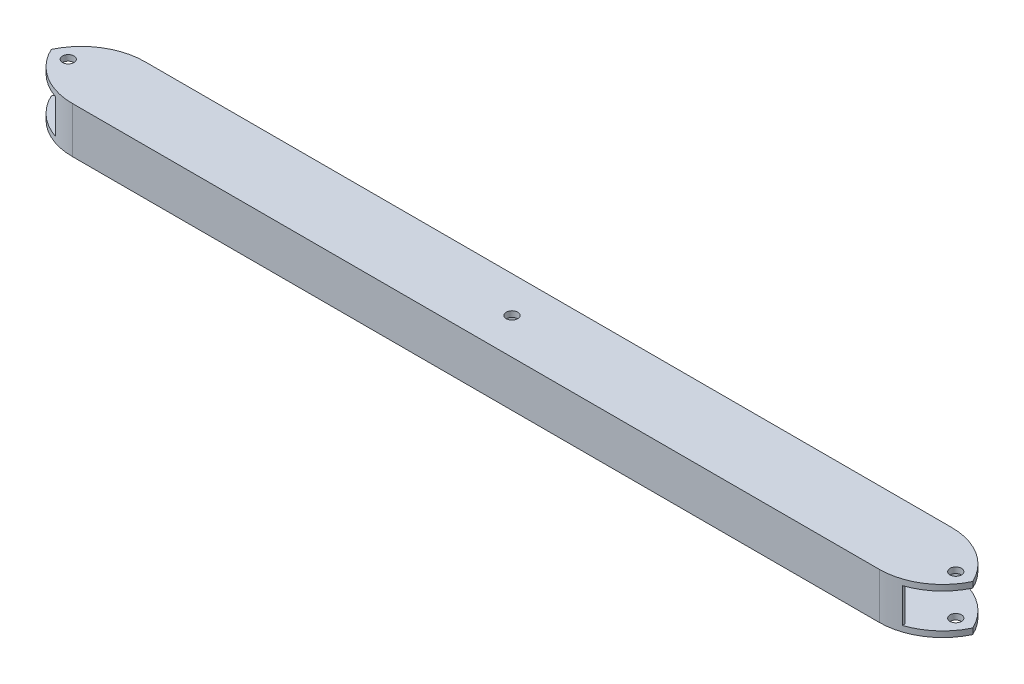
ISO-10303-21;
HEADER;
FILE_DESCRIPTION(('STEP AP214'),'2;1');
FILE_NAME('part.step','',(''),(''),'','','');
FILE_SCHEMA(('AUTOMOTIVE_DESIGN { 1 0 10303 214 1 1 1 1 }'));
ENDSEC;
DATA;
#1=APPLICATION_CONTEXT('core data for automotive mechanical design processes');
#2=APPLICATION_PROTOCOL_DEFINITION('international standard','automotive_design',2000,#1);
#3=PRODUCT_CONTEXT('',#1,'mechanical');
#4=PRODUCT('Part','Part','',(#3));
#5=PRODUCT_RELATED_PRODUCT_CATEGORY('part','',(#4));
#6=PRODUCT_DEFINITION_FORMATION('','',#4);
#7=PRODUCT_DEFINITION_CONTEXT('part definition',#1,'design');
#8=PRODUCT_DEFINITION('design','',#6,#7);
#9=PRODUCT_DEFINITION_SHAPE('','',#8);
#10=(LENGTH_UNIT() NAMED_UNIT(*) SI_UNIT(.MILLI.,.METRE.));
#11=(NAMED_UNIT(*) PLANE_ANGLE_UNIT() SI_UNIT($,.RADIAN.));
#12=(NAMED_UNIT(*) SI_UNIT($,.STERADIAN.) SOLID_ANGLE_UNIT());
#13=UNCERTAINTY_MEASURE_WITH_UNIT(LENGTH_MEASURE(1.E-05),#10,'distance_accuracy_value','');
#14=(GEOMETRIC_REPRESENTATION_CONTEXT(3) GLOBAL_UNCERTAINTY_ASSIGNED_CONTEXT((#13)) GLOBAL_UNIT_ASSIGNED_CONTEXT((#10,
#11,#12)) REPRESENTATION_CONTEXT('',''));
#15=CARTESIAN_POINT('',(0.,0.,0.));
#16=DIRECTION('',(0.,0.,1.));
#17=DIRECTION('',(1.,0.,0.));
#18=AXIS2_PLACEMENT_3D('',#15,#16,#17);
#19=CARTESIAN_POINT('',(515.5,25.4,40.0000000000002));
#20=DIRECTION('',(0.,0.,-1.));
#21=DIRECTION('',(-1.,0.,0.));
#22=AXIS2_PLACEMENT_3D('',#19,#20,#21);
#23=PLANE('',#22);
#24=DIRECTION('',(1.,0.,0.));
#25=VECTOR('',#24,1.);
#26=CARTESIAN_POINT('',(515.5,0.,40.0000000000002));
#27=LINE('',#26,#25);
#28=CARTESIAN_POINT('',(35.,0.,40.0000000000001));
#29=VERTEX_POINT('',#28);
#30=CARTESIAN_POINT('',(480.5,0.,40.0000000000002));
#31=VERTEX_POINT('',#30);
#32=EDGE_CURVE('E222',#29,#31,#27,.T.);
#33=ORIENTED_EDGE('',*,*,#32,.T.);
#34=DIRECTION('',(0.,-1.,0.));
#35=VECTOR('',#34,1.);
#36=CARTESIAN_POINT('',(480.5,25.4,40.0000000000002));
#37=LINE('',#36,#35);
#38=CARTESIAN_POINT('',(480.5,25.4,40.0000000000002));
#39=VERTEX_POINT('',#38);
#40=EDGE_CURVE('E283',#31,#39,#37,.F.);
#41=ORIENTED_EDGE('',*,*,#40,.T.);
#42=DIRECTION('',(1.,0.,0.));
#43=VECTOR('',#42,1.);
#44=CARTESIAN_POINT('',(515.5,25.4,40.0000000000002));
#45=LINE('',#44,#43);
#46=CARTESIAN_POINT('',(35.,25.4,40.0000000000001));
#47=VERTEX_POINT('',#46);
#48=EDGE_CURVE('E225',#47,#39,#45,.T.);
#49=ORIENTED_EDGE('',*,*,#48,.F.);
#50=DIRECTION('',(0.,-1.,0.));
#51=VECTOR('',#50,1.);
#52=CARTESIAN_POINT('',(35.,25.4,40.0000000000001));
#53=LINE('',#52,#51);
#54=EDGE_CURVE('E281',#47,#29,#53,.T.);
#55=ORIENTED_EDGE('',*,*,#54,.T.);
#56=EDGE_LOOP('',(#33,#41,#49,#55));
#57=FACE_BOUND('',#56,.T.);
#58=ADVANCED_FACE('F36',(#57),#23,.F.);
#59=CARTESIAN_POINT('',(0.,25.4,0.));
#60=DIRECTION('',(0.,0.,1.));
#61=DIRECTION('',(1.,0.,0.));
#62=AXIS2_PLACEMENT_3D('',#59,#60,#61);
#63=PLANE('',#62);
#64=DIRECTION('',(0.,-1.,0.));
#65=VECTOR('',#64,1.);
#66=CARTESIAN_POINT('',(480.5,25.4,0.));
#67=LINE('',#66,#65);
#68=CARTESIAN_POINT('',(480.5,25.4,0.));
#69=VERTEX_POINT('',#68);
#70=CARTESIAN_POINT('',(480.5,0.,0.));
#71=VERTEX_POINT('',#70);
#72=EDGE_CURVE('E244',#69,#71,#67,.T.);
#73=ORIENTED_EDGE('',*,*,#72,.T.);
#74=DIRECTION('',(-1.,0.,0.));
#75=VECTOR('',#74,1.);
#76=CARTESIAN_POINT('',(0.,0.,0.));
#77=LINE('',#76,#75);
#78=CARTESIAN_POINT('',(35.,0.,0.));
#79=VERTEX_POINT('',#78);
#80=EDGE_CURVE('E228',#71,#79,#77,.T.);
#81=ORIENTED_EDGE('',*,*,#80,.T.);
#82=DIRECTION('',(0.,-1.,0.));
#83=VECTOR('',#82,1.);
#84=CARTESIAN_POINT('',(35.,25.4,0.));
#85=LINE('',#84,#83);
#86=CARTESIAN_POINT('',(35.,25.4,0.));
#87=VERTEX_POINT('',#86);
#88=EDGE_CURVE('E242',#79,#87,#85,.F.);
#89=ORIENTED_EDGE('',*,*,#88,.T.);
#90=DIRECTION('',(-1.,0.,0.));
#91=VECTOR('',#90,1.);
#92=CARTESIAN_POINT('',(0.,25.4,0.));
#93=LINE('',#92,#91);
#94=EDGE_CURVE('E227',#69,#87,#93,.T.);
#95=ORIENTED_EDGE('',*,*,#94,.F.);
#96=EDGE_LOOP('',(#73,#81,#89,#95));
#97=FACE_BOUND('',#96,.T.);
#98=ADVANCED_FACE('F334',(#97),#63,.F.);
#99=CARTESIAN_POINT('',(257.75,25.4,20.));
#100=DIRECTION('',(0.,-1.,0.));
#101=DIRECTION('',(0.,0.,-1.));
#102=AXIS2_PLACEMENT_3D('',#99,#100,#101);
#103=CYLINDRICAL_SURFACE('',#102,3.17499999999997);
#104=CARTESIAN_POINT('',(257.75,22.225,20.));
#105=DIRECTION('',(0.,1.,0.));
#106=DIRECTION('',(0.,0.,1.));
#107=AXIS2_PLACEMENT_3D('',#104,#105,#106);
#108=CIRCLE('',#107,3.17499999999997);
#109=CARTESIAN_POINT('',(257.75,22.225,23.175));
#110=VERTEX_POINT('',#109);
#111=EDGE_CURVE('E203',#110,#110,#108,.T.);
#112=ORIENTED_EDGE('',*,*,#111,.F.);
#113=EDGE_LOOP('',(#112));
#114=FACE_BOUND('',#113,.T.);
#115=CARTESIAN_POINT('',(257.75,25.4,20.));
#116=DIRECTION('',(0.,1.,0.));
#117=DIRECTION('',(0.,0.,1.));
#118=AXIS2_PLACEMENT_3D('',#115,#116,#117);
#119=CIRCLE('',#118,3.17499999999997);
#120=CARTESIAN_POINT('',(257.75,25.4,23.175));
#121=VERTEX_POINT('',#120);
#122=EDGE_CURVE('E219',#121,#121,#119,.T.);
#123=ORIENTED_EDGE('',*,*,#122,.T.);
#124=EDGE_LOOP('',(#123));
#125=FACE_BOUND('',#124,.T.);
#126=ADVANCED_FACE('F369',(#114,#125),#103,.F.);
#127=CARTESIAN_POINT('',(502.72,25.4,20.));
#128=DIRECTION('',(0.,-1.,0.));
#129=DIRECTION('',(0.,0.,-1.));
#130=AXIS2_PLACEMENT_3D('',#127,#128,#129);
#131=CYLINDRICAL_SURFACE('',#130,3.17500000000008);
#132=CARTESIAN_POINT('',(502.72,22.225,20.));
#133=DIRECTION('',(0.,1.,0.));
#134=DIRECTION('',(0.,0.,1.));
#135=AXIS2_PLACEMENT_3D('',#132,#133,#134);
#136=CIRCLE('',#135,3.17500000000008);
#137=CARTESIAN_POINT('',(502.72,22.225,23.1750000000001));
#138=VERTEX_POINT('',#137);
#139=EDGE_CURVE('E200',#138,#138,#136,.T.);
#140=ORIENTED_EDGE('',*,*,#139,.F.);
#141=EDGE_LOOP('',(#140));
#142=FACE_BOUND('',#141,.T.);
#143=CARTESIAN_POINT('',(502.72,25.4,20.));
#144=DIRECTION('',(0.,1.,0.));
#145=DIRECTION('',(0.,0.,-1.));
#146=AXIS2_PLACEMENT_3D('',#143,#144,#145);
#147=CIRCLE('',#146,3.17500000000008);
#148=CARTESIAN_POINT('',(502.72,25.4,16.8249999999999));
#149=VERTEX_POINT('',#148);
#150=EDGE_CURVE('E213',#149,#149,#147,.T.);
#151=ORIENTED_EDGE('',*,*,#150,.T.);
#152=EDGE_LOOP('',(#151));
#153=FACE_BOUND('',#152,.T.);
#154=ADVANCED_FACE('F362',(#142,#153),#131,.F.);
#155=CARTESIAN_POINT('',(12.78,25.4,20.0000000000001));
#156=DIRECTION('',(0.,-1.,0.));
#157=DIRECTION('',(0.,0.,-1.));
#158=AXIS2_PLACEMENT_3D('',#155,#156,#157);
#159=CYLINDRICAL_SURFACE('',#158,3.175);
#160=CARTESIAN_POINT('',(12.78,22.225,20.0000000000001));
#161=DIRECTION('',(0.,1.,0.));
#162=DIRECTION('',(0.,0.,1.));
#163=AXIS2_PLACEMENT_3D('',#160,#161,#162);
#164=CIRCLE('',#163,3.175);
#165=CARTESIAN_POINT('',(12.78,22.225,23.1750000000001));
#166=VERTEX_POINT('',#165);
#167=EDGE_CURVE('E199',#166,#166,#164,.T.);
#168=ORIENTED_EDGE('',*,*,#167,.F.);
#169=EDGE_LOOP('',(#168));
#170=FACE_BOUND('',#169,.T.);
#171=CARTESIAN_POINT('',(12.78,25.4,20.0000000000001));
#172=DIRECTION('',(0.,1.,0.));
#173=DIRECTION('',(0.,0.,1.));
#174=AXIS2_PLACEMENT_3D('',#171,#172,#173);
#175=CIRCLE('',#174,3.175);
#176=CARTESIAN_POINT('',(12.78,25.4,23.1750000000001));
#177=VERTEX_POINT('',#176);
#178=EDGE_CURVE('E207',#177,#177,#175,.T.);
#179=ORIENTED_EDGE('',*,*,#178,.T.);
#180=EDGE_LOOP('',(#179));
#181=FACE_BOUND('',#180,.T.);
#182=ADVANCED_FACE('F353',(#170,#181),#159,.F.);
#183=CARTESIAN_POINT('',(0.,25.4,0.));
#184=DIRECTION('',(0.,-1.,0.));
#185=DIRECTION('',(0.,0.,-1.));
#186=AXIS2_PLACEMENT_3D('',#183,#184,#185);
#187=PLANE('',#186);
#188=CARTESIAN_POINT('',(480.5,25.4,5.00000000000021));
#189=DIRECTION('',(0.,-1.,0.));
#190=DIRECTION('',(0.,0.,-1.));
#191=AXIS2_PLACEMENT_3D('',#188,#189,#190);
#192=CIRCLE('',#191,35.);
#193=CARTESIAN_POINT('',(512.122776601684,25.4,20.0000000000001));
#194=VERTEX_POINT('',#193);
#195=EDGE_CURVE('E53',#39,#194,#192,.F.);
#196=ORIENTED_EDGE('',*,*,#195,.T.);
#197=CARTESIAN_POINT('',(480.5,25.4,35.));
#198=DIRECTION('',(0.,-1.,0.));
#199=DIRECTION('',(0.,0.,-1.));
#200=AXIS2_PLACEMENT_3D('',#197,#198,#199);
#201=CIRCLE('',#200,35.);
#202=EDGE_CURVE('E279',#194,#69,#201,.F.);
#203=ORIENTED_EDGE('',*,*,#202,.T.);
#204=ORIENTED_EDGE('',*,*,#94,.T.);
#205=CARTESIAN_POINT('',(35.,25.4,35.));
#206=DIRECTION('',(0.,-1.,0.));
#207=DIRECTION('',(0.,0.,-1.));
#208=AXIS2_PLACEMENT_3D('',#205,#206,#207);
#209=CIRCLE('',#208,35.);
#210=CARTESIAN_POINT('',(3.37722339831621,25.4,20.));
#211=VERTEX_POINT('',#210);
#212=EDGE_CURVE('E60',#87,#211,#209,.F.);
#213=ORIENTED_EDGE('',*,*,#212,.T.);
#214=CARTESIAN_POINT('',(35.,25.4,5.00000000000008));
#215=DIRECTION('',(0.,-1.,0.));
#216=DIRECTION('',(0.,0.,-1.));
#217=AXIS2_PLACEMENT_3D('',#214,#215,#216);
#218=CIRCLE('',#217,35.);
#219=EDGE_CURVE('E276',#211,#47,#218,.F.);
#220=ORIENTED_EDGE('',*,*,#219,.T.);
#221=ORIENTED_EDGE('',*,*,#48,.T.);
#222=EDGE_LOOP('',(#196,#203,#204,#213,#220,#221));
#223=FACE_BOUND('',#222,.T.);
#224=ORIENTED_EDGE('',*,*,#122,.F.);
#225=EDGE_LOOP('',(#224));
#226=FACE_BOUND('',#225,.T.);
#227=ORIENTED_EDGE('',*,*,#150,.F.);
#228=EDGE_LOOP('',(#227));
#229=FACE_BOUND('',#228,.T.);
#230=ORIENTED_EDGE('',*,*,#178,.F.);
#231=EDGE_LOOP('',(#230));
#232=FACE_BOUND('',#231,.T.);
#233=ADVANCED_FACE('F350',(#223,#226,#229,#232),#187,.F.);
#234=CARTESIAN_POINT('',(0.,0.,0.));
#235=DIRECTION('',(0.,-1.,0.));
#236=DIRECTION('',(0.,0.,-1.));
#237=AXIS2_PLACEMENT_3D('',#234,#235,#236);
#238=PLANE('',#237);
#239=CARTESIAN_POINT('',(502.72,0.,20.));
#240=DIRECTION('',(0.,1.,0.));
#241=DIRECTION('',(0.,0.,-1.));
#242=AXIS2_PLACEMENT_3D('',#239,#240,#241);
#243=CIRCLE('',#242,3.17500000000008);
#244=CARTESIAN_POINT('',(502.72,0.,16.8249999999999));
#245=VERTEX_POINT('',#244);
#246=EDGE_CURVE('E210',#245,#245,#243,.T.);
#247=ORIENTED_EDGE('',*,*,#246,.T.);
#248=EDGE_LOOP('',(#247));
#249=FACE_BOUND('',#248,.T.);
#250=ORIENTED_EDGE('',*,*,#80,.F.);
#251=CARTESIAN_POINT('',(480.5,0.,35.));
#252=DIRECTION('',(0.,-1.,0.));
#253=DIRECTION('',(0.,0.,-1.));
#254=AXIS2_PLACEMENT_3D('',#251,#252,#253);
#255=CIRCLE('',#254,35.);
#256=CARTESIAN_POINT('',(512.122776601684,0.,20.0000000000001));
#257=VERTEX_POINT('',#256);
#258=EDGE_CURVE('E254',#71,#257,#255,.T.);
#259=ORIENTED_EDGE('',*,*,#258,.T.);
#260=CARTESIAN_POINT('',(480.5,0.,5.00000000000021));
#261=DIRECTION('',(0.,-1.,0.));
#262=DIRECTION('',(0.,0.,-1.));
#263=AXIS2_PLACEMENT_3D('',#260,#261,#262);
#264=CIRCLE('',#263,35.);
#265=EDGE_CURVE('E251',#257,#31,#264,.T.);
#266=ORIENTED_EDGE('',*,*,#265,.T.);
#267=ORIENTED_EDGE('',*,*,#32,.F.);
#268=CARTESIAN_POINT('',(35.,0.,5.00000000000008));
#269=DIRECTION('',(0.,-1.,0.));
#270=DIRECTION('',(0.,0.,-1.));
#271=AXIS2_PLACEMENT_3D('',#268,#269,#270);
#272=CIRCLE('',#271,35.);
#273=CARTESIAN_POINT('',(3.37722339831621,0.,20.));
#274=VERTEX_POINT('',#273);
#275=EDGE_CURVE('E249',#29,#274,#272,.T.);
#276=ORIENTED_EDGE('',*,*,#275,.T.);
#277=CARTESIAN_POINT('',(35.,0.,35.));
#278=DIRECTION('',(0.,-1.,0.));
#279=DIRECTION('',(0.,0.,-1.));
#280=AXIS2_PLACEMENT_3D('',#277,#278,#279);
#281=CIRCLE('',#280,35.);
#282=EDGE_CURVE('E246',#274,#79,#281,.T.);
#283=ORIENTED_EDGE('',*,*,#282,.T.);
#284=EDGE_LOOP('',(#250,#259,#266,#267,#276,#283));
#285=FACE_BOUND('',#284,.T.);
#286=CARTESIAN_POINT('',(257.75,0.,20.));
#287=DIRECTION('',(0.,1.,0.));
#288=DIRECTION('',(0.,0.,1.));
#289=AXIS2_PLACEMENT_3D('',#286,#287,#288);
#290=CIRCLE('',#289,3.17499999999997);
#291=CARTESIAN_POINT('',(257.75,0.,23.175));
#292=VERTEX_POINT('',#291);
#293=EDGE_CURVE('E216',#292,#292,#290,.T.);
#294=ORIENTED_EDGE('',*,*,#293,.T.);
#295=EDGE_LOOP('',(#294));
#296=FACE_BOUND('',#295,.T.);
#297=CARTESIAN_POINT('',(12.78,0.,20.0000000000001));
#298=DIRECTION('',(0.,1.,0.));
#299=DIRECTION('',(0.,0.,1.));
#300=AXIS2_PLACEMENT_3D('',#297,#298,#299);
#301=CIRCLE('',#300,3.175);
#302=CARTESIAN_POINT('',(12.78,0.,23.1750000000001));
#303=VERTEX_POINT('',#302);
#304=EDGE_CURVE('E206',#303,#303,#301,.T.);
#305=ORIENTED_EDGE('',*,*,#304,.T.);
#306=EDGE_LOOP('',(#305));
#307=FACE_BOUND('',#306,.T.);
#308=ADVANCED_FACE('F330',(#249,#285,#296,#307),#238,.T.);
#309=CARTESIAN_POINT('',(257.75,3.175,20.));
#310=DIRECTION('',(0.,-1.,0.));
#311=DIRECTION('',(0.,0.,-1.));
#312=AXIS2_PLACEMENT_3D('',#309,#310,#311);
#313=CIRCLE('',#312,3.17499999999997);
#314=CARTESIAN_POINT('',(257.75,3.175,16.825));
#315=VERTEX_POINT('',#314);
#316=EDGE_CURVE('E196',#315,#315,#313,.T.);
#317=ORIENTED_EDGE('',*,*,#316,.F.);
#318=EDGE_LOOP('',(#317));
#319=FACE_BOUND('',#318,.T.);
#320=ORIENTED_EDGE('',*,*,#293,.F.);
#321=EDGE_LOOP('',(#320));
#322=FACE_BOUND('',#321,.T.);
#323=ADVANCED_FACE('F464',(#319,#322),#103,.F.);
#324=CARTESIAN_POINT('',(502.72,3.175,20.));
#325=DIRECTION('',(0.,-1.,0.));
#326=DIRECTION('',(0.,0.,-1.));
#327=AXIS2_PLACEMENT_3D('',#324,#325,#326);
#328=CIRCLE('',#327,3.17500000000008);
#329=CARTESIAN_POINT('',(502.72,3.175,16.8249999999999));
#330=VERTEX_POINT('',#329);
#331=EDGE_CURVE('E183',#330,#330,#328,.T.);
#332=ORIENTED_EDGE('',*,*,#331,.F.);
#333=EDGE_LOOP('',(#332));
#334=FACE_BOUND('',#333,.T.);
#335=ORIENTED_EDGE('',*,*,#246,.F.);
#336=EDGE_LOOP('',(#335));
#337=FACE_BOUND('',#336,.T.);
#338=ADVANCED_FACE('F372',(#334,#337),#131,.F.);
#339=CARTESIAN_POINT('',(12.78,3.175,20.0000000000001));
#340=DIRECTION('',(0.,-1.,0.));
#341=DIRECTION('',(0.,0.,-1.));
#342=AXIS2_PLACEMENT_3D('',#339,#340,#341);
#343=CIRCLE('',#342,3.175);
#344=CARTESIAN_POINT('',(12.78,3.175,16.8250000000001));
#345=VERTEX_POINT('',#344);
#346=EDGE_CURVE('E179',#345,#345,#343,.T.);
#347=ORIENTED_EDGE('',*,*,#346,.F.);
#348=EDGE_LOOP('',(#347));
#349=FACE_BOUND('',#348,.T.);
#350=ORIENTED_EDGE('',*,*,#304,.F.);
#351=EDGE_LOOP('',(#350));
#352=FACE_BOUND('',#351,.T.);
#353=ADVANCED_FACE('F365',(#349,#352),#159,.F.);
#354=CARTESIAN_POINT('',(554.168139339772,22.225,36.8250000000001));
#355=DIRECTION('',(0.,1.,0.));
#356=DIRECTION('',(0.,0.,1.));
#357=AXIS2_PLACEMENT_3D('',#354,#355,#356);
#358=PLANE('',#357);
#359=ORIENTED_EDGE('',*,*,#111,.T.);
#360=EDGE_LOOP('',(#359));
#361=FACE_BOUND('',#360,.T.);
#362=DIRECTION('',(0.,0.,-1.));
#363=VECTOR('',#362,1.);
#364=CARTESIAN_POINT('',(491.5,22.225,0.));
#365=LINE('',#364,#363);
#366=CARTESIAN_POINT('',(491.5,22.225,3.175));
#367=VERTEX_POINT('',#366);
#368=CARTESIAN_POINT('',(491.5,22.225,1.77350454832765));
#369=VERTEX_POINT('',#368);
#370=EDGE_CURVE('E165',#367,#369,#365,.T.);
#371=ORIENTED_EDGE('',*,*,#370,.T.);
#372=CARTESIAN_POINT('',(480.5,22.225,35.));
#373=DIRECTION('',(0.,1.,0.));
#374=DIRECTION('',(0.,0.,1.));
#375=AXIS2_PLACEMENT_3D('',#372,#373,#374);
#376=CIRCLE('',#375,35.);
#377=CARTESIAN_POINT('',(512.122776601684,22.225,20.0000000000001));
#378=VERTEX_POINT('',#377);
#379=EDGE_CURVE('E273',#369,#378,#376,.F.);
#380=ORIENTED_EDGE('',*,*,#379,.T.);
#381=CARTESIAN_POINT('',(480.5,22.225,5.00000000000021));
#382=DIRECTION('',(0.,1.,0.));
#383=DIRECTION('',(0.,0.,1.));
#384=AXIS2_PLACEMENT_3D('',#381,#382,#383);
#385=CIRCLE('',#384,35.);
#386=CARTESIAN_POINT('',(491.5,22.225,38.2264954516725));
#387=VERTEX_POINT('',#386);
#388=EDGE_CURVE('E161',#378,#387,#385,.F.);
#389=ORIENTED_EDGE('',*,*,#388,.T.);
#390=CARTESIAN_POINT('',(491.5,22.225,36.8250000000001));
#391=VERTEX_POINT('',#390);
#392=EDGE_CURVE('E151',#387,#391,#365,.T.);
#393=ORIENTED_EDGE('',*,*,#392,.T.);
#394=DIRECTION('',(-1.,0.,0.));
#395=VECTOR('',#394,1.);
#396=CARTESIAN_POINT('',(554.168139339772,22.225,36.8250000000001));
#397=LINE('',#396,#395);
#398=CARTESIAN_POINT('',(24.,22.225,36.8250000000001));
#399=VERTEX_POINT('',#398);
#400=EDGE_CURVE('E158',#391,#399,#397,.T.);
#401=ORIENTED_EDGE('',*,*,#400,.T.);
#402=DIRECTION('',(0.,0.,-1.));
#403=VECTOR('',#402,1.);
#404=CARTESIAN_POINT('',(24.,22.225,0.));
#405=LINE('',#404,#403);
#406=CARTESIAN_POINT('',(24.,22.225,38.2264954516724));
#407=VERTEX_POINT('',#406);
#408=EDGE_CURVE('E315',#407,#399,#405,.T.);
#409=ORIENTED_EDGE('',*,*,#408,.F.);
#410=CARTESIAN_POINT('',(35.,22.225,5.00000000000008));
#411=DIRECTION('',(0.,1.,0.));
#412=DIRECTION('',(0.,0.,1.));
#413=AXIS2_PLACEMENT_3D('',#410,#411,#412);
#414=CIRCLE('',#413,35.);
#415=CARTESIAN_POINT('',(3.37722339831621,22.225,20.));
#416=VERTEX_POINT('',#415);
#417=EDGE_CURVE('E270',#407,#416,#414,.F.);
#418=ORIENTED_EDGE('',*,*,#417,.T.);
#419=CARTESIAN_POINT('',(35.,22.225,35.));
#420=DIRECTION('',(0.,1.,0.));
#421=DIRECTION('',(0.,0.,1.));
#422=AXIS2_PLACEMENT_3D('',#419,#420,#421);
#423=CIRCLE('',#422,35.);
#424=CARTESIAN_POINT('',(24.,22.225,1.7735045483277));
#425=VERTEX_POINT('',#424);
#426=EDGE_CURVE('E268',#416,#425,#423,.F.);
#427=ORIENTED_EDGE('',*,*,#426,.T.);
#428=CARTESIAN_POINT('',(24.,22.225,3.175));
#429=VERTEX_POINT('',#428);
#430=EDGE_CURVE('E173',#429,#425,#405,.T.);
#431=ORIENTED_EDGE('',*,*,#430,.F.);
#432=DIRECTION('',(-1.,0.,0.));
#433=VECTOR('',#432,1.);
#434=CARTESIAN_POINT('',(554.168139339772,22.225,3.175));
#435=LINE('',#434,#433);
#436=EDGE_CURVE('E192',#367,#429,#435,.T.);
#437=ORIENTED_EDGE('',*,*,#436,.F.);
#438=EDGE_LOOP('',(#371,#380,#389,#393,#401,#409,#418,#427,#431,#437));
#439=FACE_BOUND('',#438,.T.);
#440=ORIENTED_EDGE('',*,*,#167,.T.);
#441=EDGE_LOOP('',(#440));
#442=FACE_BOUND('',#441,.T.);
#443=ORIENTED_EDGE('',*,*,#139,.T.);
#444=EDGE_LOOP('',(#443));
#445=FACE_BOUND('',#444,.T.);
#446=ADVANCED_FACE('F154',(#361,#439,#442,#445),#358,.F.);
#447=CARTESIAN_POINT('',(554.168139339772,3.175,36.8250000000001));
#448=DIRECTION('',(0.,0.,1.));
#449=DIRECTION('',(1.,0.,0.));
#450=AXIS2_PLACEMENT_3D('',#447,#448,#449);
#451=PLANE('',#450);
#452=ORIENTED_EDGE('',*,*,#400,.F.);
#453=DIRECTION('',(0.,-1.,0.));
#454=VECTOR('',#453,1.);
#455=CARTESIAN_POINT('',(491.5,3.175,36.8250000000001));
#456=LINE('',#455,#454);
#457=CARTESIAN_POINT('',(491.5,3.175,36.8250000000001));
#458=VERTEX_POINT('',#457);
#459=EDGE_CURVE('E168',#391,#458,#456,.T.);
#460=ORIENTED_EDGE('',*,*,#459,.T.);
#461=DIRECTION('',(-1.,0.,0.));
#462=VECTOR('',#461,1.);
#463=CARTESIAN_POINT('',(554.168139339772,3.175,36.8250000000001));
#464=LINE('',#463,#462);
#465=CARTESIAN_POINT('',(24.,3.175,36.8250000000001));
#466=VERTEX_POINT('',#465);
#467=EDGE_CURVE('E180',#458,#466,#464,.T.);
#468=ORIENTED_EDGE('',*,*,#467,.T.);
#469=DIRECTION('',(0.,1.,0.));
#470=VECTOR('',#469,1.);
#471=CARTESIAN_POINT('',(24.,3.175,36.8250000000001));
#472=LINE('',#471,#470);
#473=EDGE_CURVE('E178',#466,#399,#472,.T.);
#474=ORIENTED_EDGE('',*,*,#473,.T.);
#475=EDGE_LOOP('',(#452,#460,#468,#474));
#476=FACE_BOUND('',#475,.T.);
#477=ADVANCED_FACE('F176',(#476),#451,.F.);
#478=CARTESIAN_POINT('',(554.168139339772,3.175,3.175));
#479=DIRECTION('',(0.,-1.,0.));
#480=DIRECTION('',(0.,0.,-1.));
#481=AXIS2_PLACEMENT_3D('',#478,#479,#480);
#482=PLANE('',#481);
#483=ORIENTED_EDGE('',*,*,#316,.T.);
#484=EDGE_LOOP('',(#483));
#485=FACE_BOUND('',#484,.T.);
#486=CARTESIAN_POINT('',(480.5,3.175,5.00000000000021));
#487=DIRECTION('',(0.,-1.,0.));
#488=DIRECTION('',(0.,0.,-1.));
#489=AXIS2_PLACEMENT_3D('',#486,#487,#488);
#490=CIRCLE('',#489,35.);
#491=CARTESIAN_POINT('',(491.5,3.175,38.2264954516725));
#492=VERTEX_POINT('',#491);
#493=CARTESIAN_POINT('',(512.122776601684,3.175,20.0000000000001));
#494=VERTEX_POINT('',#493);
#495=EDGE_CURVE('E261',#492,#494,#490,.F.);
#496=ORIENTED_EDGE('',*,*,#495,.T.);
#497=CARTESIAN_POINT('',(480.5,3.175,35.));
#498=DIRECTION('',(0.,-1.,0.));
#499=DIRECTION('',(0.,0.,-1.));
#500=AXIS2_PLACEMENT_3D('',#497,#498,#499);
#501=CIRCLE('',#500,35.);
#502=CARTESIAN_POINT('',(491.5,3.175,1.77350454832765));
#503=VERTEX_POINT('',#502);
#504=EDGE_CURVE('E263',#494,#503,#501,.F.);
#505=ORIENTED_EDGE('',*,*,#504,.T.);
#506=DIRECTION('',(0.,0.,1.));
#507=VECTOR('',#506,1.);
#508=CARTESIAN_POINT('',(491.5,3.175,40.0000000000001));
#509=LINE('',#508,#507);
#510=CARTESIAN_POINT('',(491.5,3.175,3.175));
#511=VERTEX_POINT('',#510);
#512=EDGE_CURVE('E174',#503,#511,#509,.T.);
#513=ORIENTED_EDGE('',*,*,#512,.T.);
#514=DIRECTION('',(-1.,0.,0.));
#515=VECTOR('',#514,1.);
#516=CARTESIAN_POINT('',(554.168139339772,3.175,3.175));
#517=LINE('',#516,#515);
#518=CARTESIAN_POINT('',(24.,3.175,3.175));
#519=VERTEX_POINT('',#518);
#520=EDGE_CURVE('E185',#511,#519,#517,.T.);
#521=ORIENTED_EDGE('',*,*,#520,.T.);
#522=DIRECTION('',(0.,0.,1.));
#523=VECTOR('',#522,1.);
#524=CARTESIAN_POINT('',(24.,3.175,40.0000000000001));
#525=LINE('',#524,#523);
#526=CARTESIAN_POINT('',(24.,3.175,1.7735045483277));
#527=VERTEX_POINT('',#526);
#528=EDGE_CURVE('E319',#527,#519,#525,.T.);
#529=ORIENTED_EDGE('',*,*,#528,.F.);
#530=CARTESIAN_POINT('',(35.,3.175,35.));
#531=DIRECTION('',(0.,-1.,0.));
#532=DIRECTION('',(0.,0.,-1.));
#533=AXIS2_PLACEMENT_3D('',#530,#531,#532);
#534=CIRCLE('',#533,35.);
#535=CARTESIAN_POINT('',(3.37722339831621,3.175,20.));
#536=VERTEX_POINT('',#535);
#537=EDGE_CURVE('E256',#527,#536,#534,.F.);
#538=ORIENTED_EDGE('',*,*,#537,.T.);
#539=CARTESIAN_POINT('',(35.,3.175,5.00000000000008));
#540=DIRECTION('',(0.,-1.,0.));
#541=DIRECTION('',(0.,0.,-1.));
#542=AXIS2_PLACEMENT_3D('',#539,#540,#541);
#543=CIRCLE('',#542,35.);
#544=CARTESIAN_POINT('',(24.,3.175,38.2264954516724));
#545=VERTEX_POINT('',#544);
#546=EDGE_CURVE('E258',#536,#545,#543,.F.);
#547=ORIENTED_EDGE('',*,*,#546,.T.);
#548=EDGE_CURVE('E317',#466,#545,#525,.T.);
#549=ORIENTED_EDGE('',*,*,#548,.F.);
#550=ORIENTED_EDGE('',*,*,#467,.F.);
#551=EDGE_CURVE('E164',#458,#492,#509,.T.);
#552=ORIENTED_EDGE('',*,*,#551,.T.);
#553=EDGE_LOOP('',(#496,#505,#513,#521,#529,#538,#547,#549,#550,#552));
#554=FACE_BOUND('',#553,.T.);
#555=ORIENTED_EDGE('',*,*,#346,.T.);
#556=EDGE_LOOP('',(#555));
#557=FACE_BOUND('',#556,.T.);
#558=ORIENTED_EDGE('',*,*,#331,.T.);
#559=EDGE_LOOP('',(#558));
#560=FACE_BOUND('',#559,.T.);
#561=ADVANCED_FACE('F325',(#485,#554,#557,#560),#482,.F.);
#562=CARTESIAN_POINT('',(554.168139339772,22.225,3.175));
#563=DIRECTION('',(0.,0.,-1.));
#564=DIRECTION('',(-1.,0.,0.));
#565=AXIS2_PLACEMENT_3D('',#562,#563,#564);
#566=PLANE('',#565);
#567=ORIENTED_EDGE('',*,*,#520,.F.);
#568=DIRECTION('',(0.,1.,0.));
#569=VECTOR('',#568,1.);
#570=CARTESIAN_POINT('',(491.5,22.225,3.175));
#571=LINE('',#570,#569);
#572=EDGE_CURVE('E239',#511,#367,#571,.T.);
#573=ORIENTED_EDGE('',*,*,#572,.T.);
#574=ORIENTED_EDGE('',*,*,#436,.T.);
#575=DIRECTION('',(0.,-1.,0.));
#576=VECTOR('',#575,1.);
#577=CARTESIAN_POINT('',(24.,22.225,3.175));
#578=LINE('',#577,#576);
#579=EDGE_CURVE('E230',#429,#519,#578,.T.);
#580=ORIENTED_EDGE('',*,*,#579,.T.);
#581=EDGE_LOOP('',(#567,#573,#574,#580));
#582=FACE_BOUND('',#581,.T.);
#583=ADVANCED_FACE('F427',(#582),#566,.F.);
#584=CARTESIAN_POINT('',(24.,0.,0.));
#585=DIRECTION('',(1.,0.,0.));
#586=DIRECTION('',(0.,0.,-1.));
#587=AXIS2_PLACEMENT_3D('',#584,#585,#586);
#588=PLANE('',#587);
#589=DIRECTION('',(0.,-1.,0.));
#590=VECTOR('',#589,1.);
#591=CARTESIAN_POINT('',(24.,22.225,1.7735045483277));
#592=LINE('',#591,#590);
#593=EDGE_CURVE('E11',#425,#527,#592,.T.);
#594=ORIENTED_EDGE('',*,*,#593,.T.);
#595=ORIENTED_EDGE('',*,*,#528,.T.);
#596=ORIENTED_EDGE('',*,*,#579,.F.);
#597=ORIENTED_EDGE('',*,*,#430,.T.);
#598=EDGE_LOOP('',(#594,#595,#596,#597));
#599=FACE_BOUND('',#598,.T.);
#600=ADVANCED_FACE('F313',(#599),#588,.F.);
#601=ORIENTED_EDGE('',*,*,#548,.T.);
#602=DIRECTION('',(0.,-1.,0.));
#603=VECTOR('',#602,1.);
#604=CARTESIAN_POINT('',(24.,3.175,38.2264954516724));
#605=LINE('',#604,#603);
#606=EDGE_CURVE('E45',#545,#407,#605,.F.);
#607=ORIENTED_EDGE('',*,*,#606,.T.);
#608=ORIENTED_EDGE('',*,*,#408,.T.);
#609=ORIENTED_EDGE('',*,*,#473,.F.);
#610=EDGE_LOOP('',(#601,#607,#608,#609));
#611=FACE_BOUND('',#610,.T.);
#612=ADVANCED_FACE('F323',(#611),#588,.F.);
#613=CARTESIAN_POINT('',(491.5,0.,0.));
#614=DIRECTION('',(-1.,0.,0.));
#615=DIRECTION('',(0.,0.,-1.));
#616=AXIS2_PLACEMENT_3D('',#613,#614,#615);
#617=PLANE('',#616);
#618=ORIENTED_EDGE('',*,*,#512,.F.);
#619=DIRECTION('',(0.,-1.,0.));
#620=VECTOR('',#619,1.);
#621=CARTESIAN_POINT('',(491.5,3.175,1.77350454832765));
#622=LINE('',#621,#620);
#623=EDGE_CURVE('E266',#503,#369,#622,.F.);
#624=ORIENTED_EDGE('',*,*,#623,.T.);
#625=ORIENTED_EDGE('',*,*,#370,.F.);
#626=ORIENTED_EDGE('',*,*,#572,.F.);
#627=EDGE_LOOP('',(#618,#624,#625,#626));
#628=FACE_BOUND('',#627,.T.);
#629=ADVANCED_FACE('F408',(#628),#617,.F.);
#630=DIRECTION('',(0.,-1.,0.));
#631=VECTOR('',#630,1.);
#632=CARTESIAN_POINT('',(491.5,22.225,38.2264954516725));
#633=LINE('',#632,#631);
#634=EDGE_CURVE('E285',#387,#492,#633,.T.);
#635=ORIENTED_EDGE('',*,*,#634,.T.);
#636=ORIENTED_EDGE('',*,*,#551,.F.);
#637=ORIENTED_EDGE('',*,*,#459,.F.);
#638=ORIENTED_EDGE('',*,*,#392,.F.);
#639=EDGE_LOOP('',(#635,#636,#637,#638));
#640=FACE_BOUND('',#639,.T.);
#641=ADVANCED_FACE('F169',(#640),#617,.F.);
#642=CARTESIAN_POINT('',(480.5,25.4,5.00000000000021));
#643=DIRECTION('',(0.,-1.,0.));
#644=DIRECTION('',(0.,0.,-1.));
#645=AXIS2_PLACEMENT_3D('',#642,#643,#644);
#646=CYLINDRICAL_SURFACE('',#645,35.);
#647=ORIENTED_EDGE('',*,*,#195,.F.);
#648=ORIENTED_EDGE('',*,*,#40,.F.);
#649=ORIENTED_EDGE('',*,*,#265,.F.);
#650=DIRECTION('',(0.,-1.,0.));
#651=VECTOR('',#650,1.);
#652=CARTESIAN_POINT('',(512.122776601684,6.35,20.0000000000001));
#653=LINE('',#652,#651);
#654=EDGE_CURVE('E288',#494,#257,#653,.T.);
#655=ORIENTED_EDGE('',*,*,#654,.F.);
#656=ORIENTED_EDGE('',*,*,#495,.F.);
#657=ORIENTED_EDGE('',*,*,#634,.F.);
#658=ORIENTED_EDGE('',*,*,#388,.F.);
#659=DIRECTION('',(0.,-1.,0.));
#660=VECTOR('',#659,1.);
#661=CARTESIAN_POINT('',(512.122776601684,19.05,20.0000000000001));
#662=LINE('',#661,#660);
#663=EDGE_CURVE('E291',#194,#378,#662,.T.);
#664=ORIENTED_EDGE('',*,*,#663,.F.);
#665=EDGE_LOOP('',(#647,#648,#649,#655,#656,#657,#658,#664));
#666=FACE_BOUND('',#665,.T.);
#667=ADVANCED_FACE('F346',(#666),#646,.T.);
#668=CARTESIAN_POINT('',(480.5,25.4,35.));
#669=DIRECTION('',(0.,-1.,0.));
#670=DIRECTION('',(0.,0.,-1.));
#671=AXIS2_PLACEMENT_3D('',#668,#669,#670);
#672=CYLINDRICAL_SURFACE('',#671,35.);
#673=ORIENTED_EDGE('',*,*,#379,.F.);
#674=ORIENTED_EDGE('',*,*,#623,.F.);
#675=ORIENTED_EDGE('',*,*,#504,.F.);
#676=ORIENTED_EDGE('',*,*,#654,.T.);
#677=ORIENTED_EDGE('',*,*,#258,.F.);
#678=ORIENTED_EDGE('',*,*,#72,.F.);
#679=ORIENTED_EDGE('',*,*,#202,.F.);
#680=ORIENTED_EDGE('',*,*,#663,.T.);
#681=EDGE_LOOP('',(#673,#674,#675,#676,#677,#678,#679,#680));
#682=FACE_BOUND('',#681,.T.);
#683=ADVANCED_FACE('F341',(#682),#672,.T.);
#684=CARTESIAN_POINT('',(35.,25.4,35.));
#685=DIRECTION('',(0.,-1.,0.));
#686=DIRECTION('',(0.,0.,-1.));
#687=AXIS2_PLACEMENT_3D('',#684,#685,#686);
#688=CYLINDRICAL_SURFACE('',#687,35.);
#689=ORIENTED_EDGE('',*,*,#212,.F.);
#690=ORIENTED_EDGE('',*,*,#88,.F.);
#691=ORIENTED_EDGE('',*,*,#282,.F.);
#692=DIRECTION('',(0.,-1.,0.));
#693=VECTOR('',#692,1.);
#694=CARTESIAN_POINT('',(3.3772233983162,6.35,20.));
#695=LINE('',#694,#693);
#696=EDGE_CURVE('E293',#536,#274,#695,.T.);
#697=ORIENTED_EDGE('',*,*,#696,.F.);
#698=ORIENTED_EDGE('',*,*,#537,.F.);
#699=ORIENTED_EDGE('',*,*,#593,.F.);
#700=ORIENTED_EDGE('',*,*,#426,.F.);
#701=DIRECTION('',(0.,-1.,0.));
#702=VECTOR('',#701,1.);
#703=CARTESIAN_POINT('',(3.3772233983162,19.05,20.));
#704=LINE('',#703,#702);
#705=EDGE_CURVE('E40',#211,#416,#704,.T.);
#706=ORIENTED_EDGE('',*,*,#705,.F.);
#707=EDGE_LOOP('',(#689,#690,#691,#697,#698,#699,#700,#706));
#708=FACE_BOUND('',#707,.T.);
#709=ADVANCED_FACE('F38',(#708),#688,.T.);
#710=CARTESIAN_POINT('',(35.,25.4,5.00000000000008));
#711=DIRECTION('',(0.,-1.,0.));
#712=DIRECTION('',(0.,0.,-1.));
#713=AXIS2_PLACEMENT_3D('',#710,#711,#712);
#714=CYLINDRICAL_SURFACE('',#713,35.);
#715=ORIENTED_EDGE('',*,*,#417,.F.);
#716=ORIENTED_EDGE('',*,*,#606,.F.);
#717=ORIENTED_EDGE('',*,*,#546,.F.);
#718=ORIENTED_EDGE('',*,*,#696,.T.);
#719=ORIENTED_EDGE('',*,*,#275,.F.);
#720=ORIENTED_EDGE('',*,*,#54,.F.);
#721=ORIENTED_EDGE('',*,*,#219,.F.);
#722=ORIENTED_EDGE('',*,*,#705,.T.);
#723=EDGE_LOOP('',(#715,#716,#717,#718,#719,#720,#721,#722));
#724=FACE_BOUND('',#723,.T.);
#725=ADVANCED_FACE('F302',(#724),#714,.T.);
#726=CLOSED_SHELL('',(#58,#98,#126,#154,#182,#233,#308,#323,#338,#353,#446,#477,#561,#583,#600,
#612,#629,#641,#667,#683,#709,#725));
#727=MANIFOLD_SOLID_BREP('B2',#726);
#728=ADVANCED_BREP_SHAPE_REPRESENTATION('',(#18,#727),#14);
#729=SHAPE_DEFINITION_REPRESENTATION(#9,#728);
ENDSEC;
END-ISO-10303-21;
